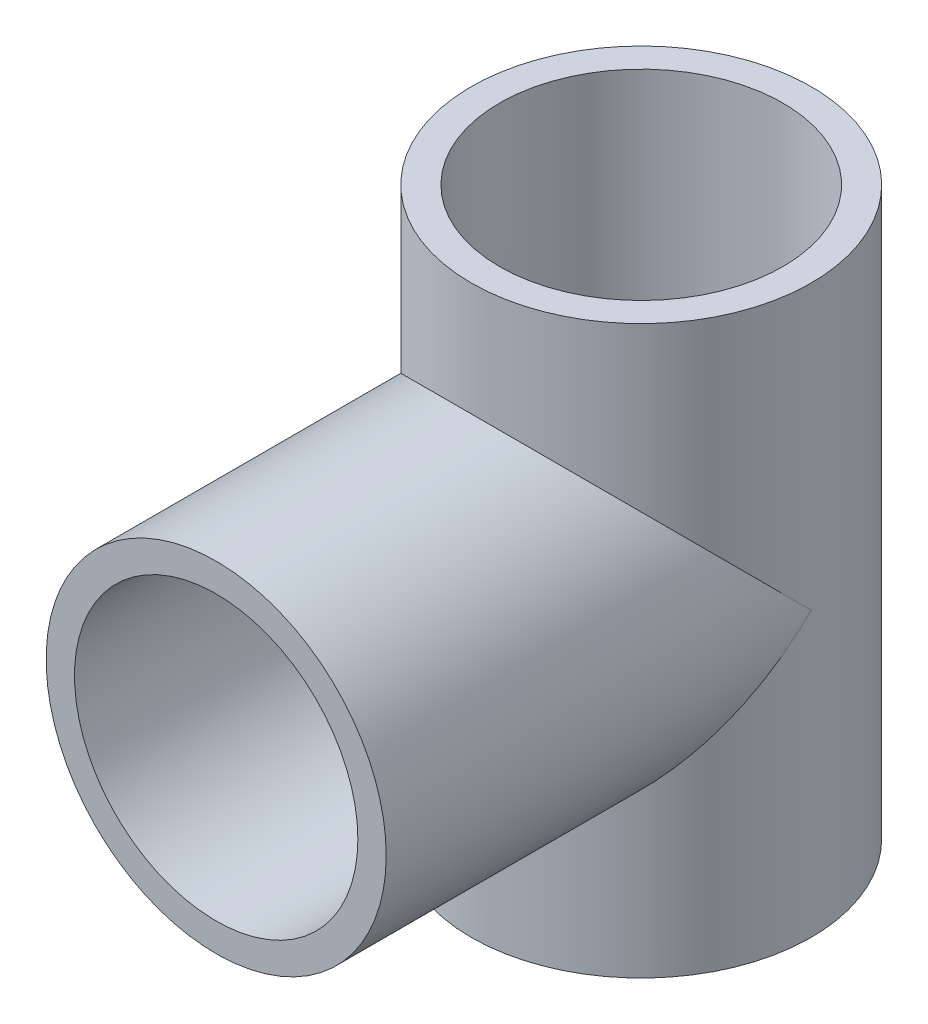
ISO-10303-21;
HEADER;
FILE_DESCRIPTION(('STEP AP214'),'2;1');
FILE_NAME('part.step','',(''),(''),'','','');
FILE_SCHEMA(('AUTOMOTIVE_DESIGN { 1 0 10303 214 1 1 1 1 }'));
ENDSEC;
DATA;
#1=APPLICATION_CONTEXT('core data for automotive mechanical design processes');
#2=APPLICATION_PROTOCOL_DEFINITION('international standard','automotive_design',2000,#1);
#3=PRODUCT_CONTEXT('',#1,'mechanical');
#4=PRODUCT('Part','Part','',(#3));
#5=PRODUCT_RELATED_PRODUCT_CATEGORY('part','',(#4));
#6=PRODUCT_DEFINITION_FORMATION('','',#4);
#7=PRODUCT_DEFINITION_CONTEXT('part definition',#1,'design');
#8=PRODUCT_DEFINITION('design','',#6,#7);
#9=PRODUCT_DEFINITION_SHAPE('','',#8);
#10=(LENGTH_UNIT() NAMED_UNIT(*) SI_UNIT(.MILLI.,.METRE.));
#11=(NAMED_UNIT(*) PLANE_ANGLE_UNIT() SI_UNIT($,.RADIAN.));
#12=(NAMED_UNIT(*) SI_UNIT($,.STERADIAN.) SOLID_ANGLE_UNIT());
#13=UNCERTAINTY_MEASURE_WITH_UNIT(LENGTH_MEASURE(1.E-05),#10,'distance_accuracy_value','');
#14=(GEOMETRIC_REPRESENTATION_CONTEXT(3) GLOBAL_UNCERTAINTY_ASSIGNED_CONTEXT((#13)) GLOBAL_UNIT_ASSIGNED_CONTEXT((#10,
#11,#12)) REPRESENTATION_CONTEXT('',''));
#15=CARTESIAN_POINT('',(0.,0.,0.));
#16=DIRECTION('',(0.,0.,1.));
#17=DIRECTION('',(1.,0.,0.));
#18=AXIS2_PLACEMENT_3D('',#15,#16,#17);
#19=CARTESIAN_POINT('',(0.,20.,0.));
#20=DIRECTION('',(0.,-1.,0.));
#21=DIRECTION('',(0.,0.,-1.));
#22=AXIS2_PLACEMENT_3D('',#19,#20,#21);
#23=CYLINDRICAL_SURFACE('',#22,12.);
#24=CARTESIAN_POINT('',(0.,-20.,0.));
#25=DIRECTION('',(0.,1.,0.));
#26=DIRECTION('',(0.,0.,1.));
#27=AXIS2_PLACEMENT_3D('',#24,#25,#26);
#28=CIRCLE('',#27,12.);
#29=CARTESIAN_POINT('',(0.,-20.,12.));
#30=VERTEX_POINT('',#29);
#31=EDGE_CURVE('E86',#30,#30,#28,.T.);
#32=ORIENTED_EDGE('',*,*,#31,.T.);
#33=EDGE_LOOP('',(#32));
#34=FACE_BOUND('',#33,.T.);
#35=CARTESIAN_POINT('',(0.,20.,0.));
#36=DIRECTION('',(0.,1.,0.));
#37=DIRECTION('',(0.,0.,1.));
#38=AXIS2_PLACEMENT_3D('',#35,#36,#37);
#39=CIRCLE('',#38,12.);
#40=CARTESIAN_POINT('',(0.,20.,12.));
#41=VERTEX_POINT('',#40);
#42=EDGE_CURVE('E63',#41,#41,#39,.T.);
#43=ORIENTED_EDGE('',*,*,#42,.F.);
#44=EDGE_LOOP('',(#43));
#45=FACE_BOUND('',#44,.T.);
#46=CARTESIAN_POINT('',(0.,0.,0.));
#47=DIRECTION('',(0.,-0.707106781186547,-0.707106781186547));
#48=DIRECTION('',(0.,-0.707106781186547,0.707106781186547));
#49=AXIS2_PLACEMENT_3D('',#46,#47,#48);
#50=ELLIPSE('',#49,16.9705627484771,12.);
#51=CARTESIAN_POINT('',(-12.,0.,0.));
#52=VERTEX_POINT('',#51);
#53=CARTESIAN_POINT('',(12.,0.,0.));
#54=VERTEX_POINT('',#53);
#55=EDGE_CURVE('E80',#52,#54,#50,.F.);
#56=ORIENTED_EDGE('',*,*,#55,.F.);
#57=CARTESIAN_POINT('',(0.,0.,0.));
#58=DIRECTION('',(0.,-0.707106781186547,0.707106781186547));
#59=DIRECTION('',(0.,-0.707106781186547,-0.707106781186547));
#60=AXIS2_PLACEMENT_3D('',#57,#58,#59);
#61=ELLIPSE('',#60,16.9705627484771,12.);
#62=EDGE_CURVE('E55',#54,#52,#61,.T.);
#63=ORIENTED_EDGE('',*,*,#62,.F.);
#64=EDGE_LOOP('',(#56,#63));
#65=FACE_BOUND('',#64,.T.);
#66=ADVANCED_FACE('F37',(#34,#45,#65),#23,.T.);
#67=CARTESIAN_POINT('',(0.,20.,0.));
#68=DIRECTION('',(0.,-1.,0.));
#69=DIRECTION('',(0.,0.,-1.));
#70=AXIS2_PLACEMENT_3D('',#67,#68,#69);
#71=CYLINDRICAL_SURFACE('',#70,10.);
#72=CARTESIAN_POINT('',(0.,20.,0.));
#73=DIRECTION('',(0.,1.,0.));
#74=DIRECTION('',(0.,0.,1.));
#75=AXIS2_PLACEMENT_3D('',#72,#73,#74);
#76=CIRCLE('',#75,10.);
#77=CARTESIAN_POINT('',(0.,20.,10.));
#78=VERTEX_POINT('',#77);
#79=EDGE_CURVE('E83',#78,#78,#76,.T.);
#80=ORIENTED_EDGE('',*,*,#79,.T.);
#81=EDGE_LOOP('',(#80));
#82=FACE_BOUND('',#81,.T.);
#83=CARTESIAN_POINT('',(0.,0.,0.));
#84=DIRECTION('',(0.,-0.707106781186547,-0.707106781186547));
#85=DIRECTION('',(0.,0.707106781186547,-0.707106781186547));
#86=AXIS2_PLACEMENT_3D('',#83,#84,#85);
#87=ELLIPSE('',#86,14.1421356237309,10.);
#88=CARTESIAN_POINT('',(-10.,0.,0.));
#89=VERTEX_POINT('',#88);
#90=CARTESIAN_POINT('',(10.,0.,0.));
#91=VERTEX_POINT('',#90);
#92=EDGE_CURVE('E44',#89,#91,#87,.F.);
#93=ORIENTED_EDGE('',*,*,#92,.T.);
#94=CARTESIAN_POINT('',(0.,0.,0.));
#95=DIRECTION('',(0.,0.707106781186547,-0.707106781186547));
#96=DIRECTION('',(0.,-0.707106781186547,-0.707106781186547));
#97=AXIS2_PLACEMENT_3D('',#94,#95,#96);
#98=ELLIPSE('',#97,14.1421356237309,10.);
#99=EDGE_CURVE('E11',#91,#89,#98,.F.);
#100=ORIENTED_EDGE('',*,*,#99,.T.);
#101=EDGE_LOOP('',(#93,#100));
#102=FACE_BOUND('',#101,.T.);
#103=CARTESIAN_POINT('',(0.,-20.,0.));
#104=DIRECTION('',(0.,1.,0.));
#105=DIRECTION('',(0.,0.,1.));
#106=AXIS2_PLACEMENT_3D('',#103,#104,#105);
#107=CIRCLE('',#106,10.);
#108=CARTESIAN_POINT('',(0.,-20.,10.));
#109=VERTEX_POINT('',#108);
#110=EDGE_CURVE('E82',#109,#109,#107,.T.);
#111=ORIENTED_EDGE('',*,*,#110,.F.);
#112=EDGE_LOOP('',(#111));
#113=FACE_BOUND('',#112,.T.);
#114=ADVANCED_FACE('F60',(#82,#102,#113),#71,.F.);
#115=CARTESIAN_POINT('',(0.,20.,0.));
#116=DIRECTION('',(0.,1.,0.));
#117=DIRECTION('',(0.,0.,1.));
#118=AXIS2_PLACEMENT_3D('',#115,#116,#117);
#119=PLANE('',#118);
#120=ORIENTED_EDGE('',*,*,#42,.T.);
#121=EDGE_LOOP('',(#120));
#122=FACE_BOUND('',#121,.T.);
#123=ORIENTED_EDGE('',*,*,#79,.F.);
#124=EDGE_LOOP('',(#123));
#125=FACE_BOUND('',#124,.T.);
#126=ADVANCED_FACE('F99',(#122,#125),#119,.T.);
#127=CARTESIAN_POINT('',(0.,-20.,0.));
#128=DIRECTION('',(0.,1.,0.));
#129=DIRECTION('',(0.,0.,1.));
#130=AXIS2_PLACEMENT_3D('',#127,#128,#129);
#131=PLANE('',#130);
#132=ORIENTED_EDGE('',*,*,#31,.F.);
#133=EDGE_LOOP('',(#132));
#134=FACE_BOUND('',#133,.T.);
#135=ORIENTED_EDGE('',*,*,#110,.T.);
#136=EDGE_LOOP('',(#135));
#137=FACE_BOUND('',#136,.T.);
#138=ADVANCED_FACE('F96',(#134,#137),#131,.F.);
#139=CARTESIAN_POINT('',(0.,0.,30.));
#140=DIRECTION('',(0.,0.,-1.));
#141=DIRECTION('',(-1.,0.,0.));
#142=AXIS2_PLACEMENT_3D('',#139,#140,#141);
#143=CYLINDRICAL_SURFACE('',#142,12.);
#144=CARTESIAN_POINT('',(0.,0.,30.));
#145=DIRECTION('',(0.,0.,1.));
#146=DIRECTION('',(1.,0.,0.));
#147=AXIS2_PLACEMENT_3D('',#144,#145,#146);
#148=CIRCLE('',#147,12.);
#149=CARTESIAN_POINT('',(12.,0.,30.));
#150=VERTEX_POINT('',#149);
#151=EDGE_CURVE('E74',#150,#150,#148,.T.);
#152=ORIENTED_EDGE('',*,*,#151,.F.);
#153=EDGE_LOOP('',(#152));
#154=FACE_BOUND('',#153,.T.);
#155=ORIENTED_EDGE('',*,*,#62,.T.);
#156=ORIENTED_EDGE('',*,*,#55,.T.);
#157=EDGE_LOOP('',(#155,#156));
#158=FACE_BOUND('',#157,.T.);
#159=ADVANCED_FACE('F68',(#154,#158),#143,.T.);
#160=CARTESIAN_POINT('',(0.,0.,30.));
#161=DIRECTION('',(0.,0.,-1.));
#162=DIRECTION('',(-1.,0.,0.));
#163=AXIS2_PLACEMENT_3D('',#160,#161,#162);
#164=CYLINDRICAL_SURFACE('',#163,10.);
#165=ORIENTED_EDGE('',*,*,#99,.F.);
#166=ORIENTED_EDGE('',*,*,#92,.F.);
#167=EDGE_LOOP('',(#165,#166));
#168=FACE_BOUND('',#167,.T.);
#169=CARTESIAN_POINT('',(0.,0.,30.));
#170=DIRECTION('',(0.,0.,1.));
#171=DIRECTION('',(1.,0.,0.));
#172=AXIS2_PLACEMENT_3D('',#169,#170,#171);
#173=CIRCLE('',#172,10.);
#174=CARTESIAN_POINT('',(10.,0.,30.));
#175=VERTEX_POINT('',#174);
#176=EDGE_CURVE('E72',#175,#175,#173,.T.);
#177=ORIENTED_EDGE('',*,*,#176,.T.);
#178=EDGE_LOOP('',(#177));
#179=FACE_BOUND('',#178,.T.);
#180=ADVANCED_FACE('F64',(#168,#179),#164,.F.);
#181=CARTESIAN_POINT('',(0.,0.,30.));
#182=DIRECTION('',(0.,0.,1.));
#183=DIRECTION('',(1.,0.,0.));
#184=AXIS2_PLACEMENT_3D('',#181,#182,#183);
#185=PLANE('',#184);
#186=ORIENTED_EDGE('',*,*,#151,.T.);
#187=EDGE_LOOP('',(#186));
#188=FACE_BOUND('',#187,.T.);
#189=ORIENTED_EDGE('',*,*,#176,.F.);
#190=EDGE_LOOP('',(#189));
#191=FACE_BOUND('',#190,.T.);
#192=ADVANCED_FACE('F67',(#188,#191),#185,.T.);
#193=CLOSED_SHELL('',(#66,#114,#126,#138,#159,#180,#192));
#194=MANIFOLD_SOLID_BREP('B2',#193);
#195=ADVANCED_BREP_SHAPE_REPRESENTATION('',(#18,#194),#14);
#196=SHAPE_DEFINITION_REPRESENTATION(#9,#195);
ENDSEC;
END-ISO-10303-21;
